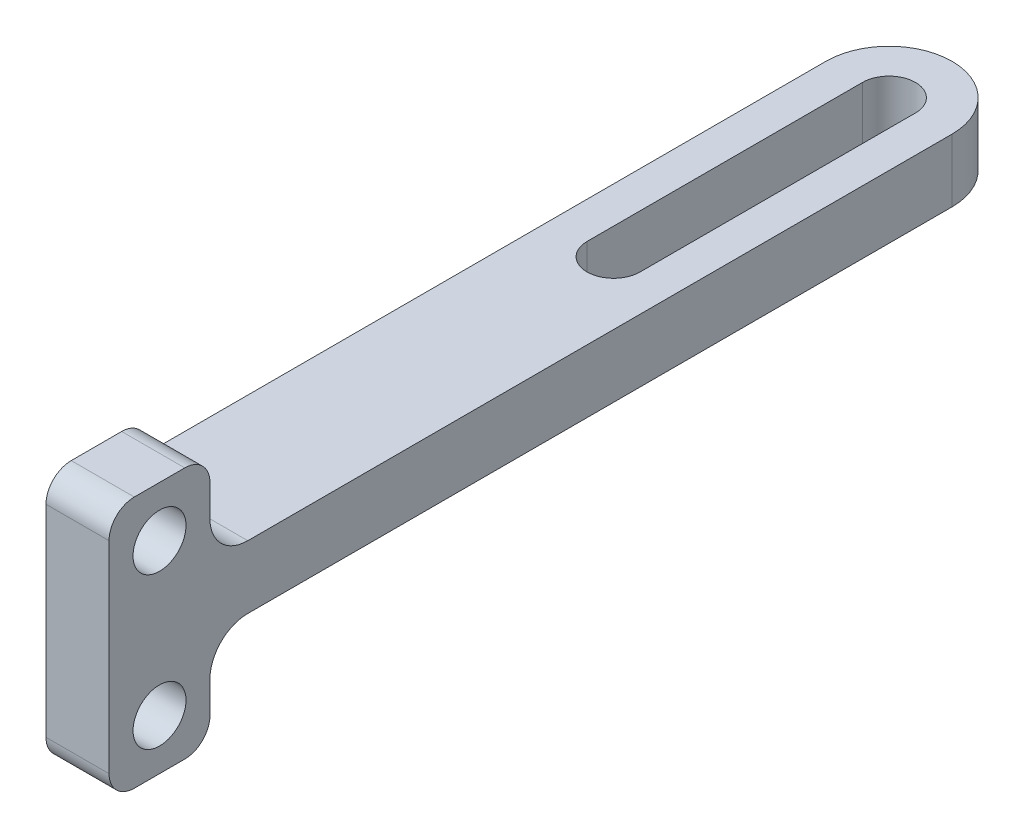
ISO-10303-21;
HEADER;
FILE_DESCRIPTION(('STEP AP214'),'2;1');
FILE_NAME('part.step','',(''),(''),'','','');
FILE_SCHEMA(('AUTOMOTIVE_DESIGN { 1 0 10303 214 1 1 1 1 }'));
ENDSEC;
DATA;
#1=APPLICATION_CONTEXT('core data for automotive mechanical design processes');
#2=APPLICATION_PROTOCOL_DEFINITION('international standard','automotive_design',2000,#1);
#3=PRODUCT_CONTEXT('',#1,'mechanical');
#4=PRODUCT('Part','Part','',(#3));
#5=PRODUCT_RELATED_PRODUCT_CATEGORY('part','',(#4));
#6=PRODUCT_DEFINITION_FORMATION('','',#4);
#7=PRODUCT_DEFINITION_CONTEXT('part definition',#1,'design');
#8=PRODUCT_DEFINITION('design','',#6,#7);
#9=PRODUCT_DEFINITION_SHAPE('','',#8);
#10=(LENGTH_UNIT() NAMED_UNIT(*) SI_UNIT(.MILLI.,.METRE.));
#11=(NAMED_UNIT(*) PLANE_ANGLE_UNIT() SI_UNIT($,.RADIAN.));
#12=(NAMED_UNIT(*) SI_UNIT($,.STERADIAN.) SOLID_ANGLE_UNIT());
#13=UNCERTAINTY_MEASURE_WITH_UNIT(LENGTH_MEASURE(1.E-05),#10,'distance_accuracy_value','');
#14=(GEOMETRIC_REPRESENTATION_CONTEXT(3) GLOBAL_UNCERTAINTY_ASSIGNED_CONTEXT((#13)) GLOBAL_UNIT_ASSIGNED_CONTEXT((#10,
#11,#12)) REPRESENTATION_CONTEXT('',''));
#15=CARTESIAN_POINT('',(0.,0.,0.));
#16=DIRECTION('',(0.,0.,1.));
#17=DIRECTION('',(1.,0.,0.));
#18=AXIS2_PLACEMENT_3D('',#15,#16,#17);
#19=CARTESIAN_POINT('',(-5.,5.,0.));
#20=DIRECTION('',(1.,0.,0.));
#21=DIRECTION('',(0.,0.,-1.));
#22=AXIS2_PLACEMENT_3D('',#19,#20,#21);
#23=PLANE('',#22);
#24=DIRECTION('',(0.,0.,1.));
#25=VECTOR('',#24,1.);
#26=CARTESIAN_POINT('',(-5.,0.,0.));
#27=LINE('',#26,#25);
#28=CARTESIAN_POINT('',(-5.,0.,-13.8358035652075));
#29=VERTEX_POINT('',#28);
#30=CARTESIAN_POINT('',(-5.,0.,39.));
#31=VERTEX_POINT('',#30);
#32=EDGE_CURVE('E296',#29,#31,#27,.T.);
#33=ORIENTED_EDGE('',*,*,#32,.T.);
#34=DIRECTION('',(0.,-1.,0.));
#35=VECTOR('',#34,1.);
#36=CARTESIAN_POINT('',(-5.,5.,39.));
#37=LINE('',#36,#35);
#38=CARTESIAN_POINT('',(-5.,5.,39.));
#39=VERTEX_POINT('',#38);
#40=EDGE_CURVE('E217',#31,#39,#37,.F.);
#41=ORIENTED_EDGE('',*,*,#40,.T.);
#42=DIRECTION('',(0.,0.,1.));
#43=VECTOR('',#42,1.);
#44=CARTESIAN_POINT('',(-5.,5.,0.));
#45=LINE('',#44,#43);
#46=CARTESIAN_POINT('',(-5.,5.,-13.8358035652075));
#47=VERTEX_POINT('',#46);
#48=EDGE_CURVE('E289',#47,#39,#45,.T.);
#49=ORIENTED_EDGE('',*,*,#48,.F.);
#50=DIRECTION('',(0.,-1.,0.));
#51=VECTOR('',#50,1.);
#52=CARTESIAN_POINT('',(-5.,5.,-13.8358035652075));
#53=LINE('',#52,#51);
#54=EDGE_CURVE('E301',#47,#29,#53,.T.);
#55=ORIENTED_EDGE('',*,*,#54,.T.);
#56=EDGE_LOOP('',(#33,#41,#49,#55));
#57=FACE_BOUND('',#56,.T.);
#58=ADVANCED_FACE('F33',(#57),#23,.F.);
#59=CARTESIAN_POINT('',(0.,5.,-13.8358035652075));
#60=DIRECTION('',(0.,1.,0.));
#61=DIRECTION('',(0.,0.,1.));
#62=AXIS2_PLACEMENT_3D('',#59,#60,#61);
#63=PLANE('',#62);
#64=DIRECTION('',(-1.,0.,0.));
#65=VECTOR('',#64,1.);
#66=CARTESIAN_POINT('',(-4.99999999999999,5.,42.));
#67=LINE('',#66,#65);
#68=CARTESIAN_POINT('',(0.,5.,42.));
#69=VERTEX_POINT('',#68);
#70=CARTESIAN_POINT('',(-2.,5.,42.));
#71=VERTEX_POINT('',#70);
#72=EDGE_CURVE('E187',#69,#71,#67,.T.);
#73=ORIENTED_EDGE('',*,*,#72,.F.);
#74=DIRECTION('',(1.,0.,0.));
#75=VECTOR('',#74,1.);
#76=CARTESIAN_POINT('',(5.,5.,42.));
#77=LINE('',#76,#75);
#78=CARTESIAN_POINT('',(5.,5.,42.));
#79=VERTEX_POINT('',#78);
#80=EDGE_CURVE('E195',#69,#79,#77,.T.);
#81=ORIENTED_EDGE('',*,*,#80,.T.);
#82=DIRECTION('',(0.,0.,-1.));
#83=VECTOR('',#82,1.);
#84=CARTESIAN_POINT('',(5.,5.,45.));
#85=LINE('',#84,#83);
#86=CARTESIAN_POINT('',(5.,5.,-13.8358035652075));
#87=VERTEX_POINT('',#86);
#88=EDGE_CURVE('E225',#79,#87,#85,.T.);
#89=ORIENTED_EDGE('',*,*,#88,.T.);
#90=CARTESIAN_POINT('',(0.,5.,-13.8358035652075));
#91=DIRECTION('',(0.,1.,0.));
#92=DIRECTION('',(0.,0.,1.));
#93=AXIS2_PLACEMENT_3D('',#90,#91,#92);
#94=CIRCLE('',#93,5.);
#95=EDGE_CURVE('E286',#87,#47,#94,.T.);
#96=ORIENTED_EDGE('',*,*,#95,.T.);
#97=ORIENTED_EDGE('',*,*,#48,.T.);
#98=CARTESIAN_POINT('',(-2.,5.,39.));
#99=DIRECTION('',(0.,1.,0.));
#100=DIRECTION('',(0.,0.,1.));
#101=AXIS2_PLACEMENT_3D('',#98,#99,#100);
#102=CIRCLE('',#101,3.);
#103=EDGE_CURVE('E199',#39,#71,#102,.T.);
#104=ORIENTED_EDGE('',*,*,#103,.T.);
#105=EDGE_LOOP('',(#73,#81,#89,#96,#97,#104));
#106=FACE_BOUND('',#105,.T.);
#107=DIRECTION('',(0.,0.,-1.));
#108=VECTOR('',#107,1.);
#109=CARTESIAN_POINT('',(2.1,5.,-13.8358035652075));
#110=LINE('',#109,#108);
#111=CARTESIAN_POINT('',(2.1,5.,8.));
#112=VERTEX_POINT('',#111);
#113=CARTESIAN_POINT('',(2.1,5.,-13.8358035652075));
#114=VERTEX_POINT('',#113);
#115=EDGE_CURVE('E257',#112,#114,#110,.T.);
#116=ORIENTED_EDGE('',*,*,#115,.F.);
#117=CARTESIAN_POINT('',(0.,5.,8.));
#118=DIRECTION('',(0.,1.,0.));
#119=DIRECTION('',(0.,0.,1.));
#120=AXIS2_PLACEMENT_3D('',#117,#118,#119);
#121=CIRCLE('',#120,2.1);
#122=CARTESIAN_POINT('',(-2.1,5.,8.));
#123=VERTEX_POINT('',#122);
#124=EDGE_CURVE('E255',#123,#112,#121,.T.);
#125=ORIENTED_EDGE('',*,*,#124,.F.);
#126=DIRECTION('',(0.,0.,1.));
#127=VECTOR('',#126,1.);
#128=CARTESIAN_POINT('',(-2.1,5.,8.));
#129=LINE('',#128,#127);
#130=CARTESIAN_POINT('',(-2.1,5.,-13.8358035652075));
#131=VERTEX_POINT('',#130);
#132=EDGE_CURVE('E263',#131,#123,#129,.T.);
#133=ORIENTED_EDGE('',*,*,#132,.F.);
#134=CARTESIAN_POINT('',(0.,5.,-13.8358035652075));
#135=DIRECTION('',(0.,1.,0.));
#136=DIRECTION('',(0.,0.,1.));
#137=AXIS2_PLACEMENT_3D('',#134,#135,#136);
#138=CIRCLE('',#137,2.1);
#139=EDGE_CURVE('E260',#114,#131,#138,.T.);
#140=ORIENTED_EDGE('',*,*,#139,.F.);
#141=EDGE_LOOP('',(#116,#125,#133,#140));
#142=FACE_BOUND('',#141,.T.);
#143=ADVANCED_FACE('F193',(#106,#142),#63,.T.);
#144=CARTESIAN_POINT('',(0.,0.,-13.8358035652075));
#145=DIRECTION('',(0.,1.,0.));
#146=DIRECTION('',(0.,0.,1.));
#147=AXIS2_PLACEMENT_3D('',#144,#145,#146);
#148=PLANE('',#147);
#149=DIRECTION('',(0.,0.,-1.));
#150=VECTOR('',#149,1.);
#151=CARTESIAN_POINT('',(5.,0.,0.));
#152=LINE('',#151,#150);
#153=CARTESIAN_POINT('',(5.,0.,42.));
#154=VERTEX_POINT('',#153);
#155=CARTESIAN_POINT('',(5.,0.,-13.8358035652075));
#156=VERTEX_POINT('',#155);
#157=EDGE_CURVE('E290',#154,#156,#152,.T.);
#158=ORIENTED_EDGE('',*,*,#157,.F.);
#159=DIRECTION('',(1.,0.,0.));
#160=VECTOR('',#159,1.);
#161=CARTESIAN_POINT('',(0.,0.,42.));
#162=LINE('',#161,#160);
#163=CARTESIAN_POINT('',(0.,0.,42.));
#164=VERTEX_POINT('',#163);
#165=EDGE_CURVE('E213',#154,#164,#162,.F.);
#166=ORIENTED_EDGE('',*,*,#165,.T.);
#167=DIRECTION('',(1.,0.,0.));
#168=VECTOR('',#167,1.);
#169=CARTESIAN_POINT('',(-4.99999999999999,0.,42.));
#170=LINE('',#169,#168);
#171=CARTESIAN_POINT('',(-2.,0.,42.));
#172=VERTEX_POINT('',#171);
#173=EDGE_CURVE('E189',#172,#164,#170,.T.);
#174=ORIENTED_EDGE('',*,*,#173,.F.);
#175=CARTESIAN_POINT('',(-2.,0.,39.));
#176=DIRECTION('',(0.,1.,0.));
#177=DIRECTION('',(0.,0.,1.));
#178=AXIS2_PLACEMENT_3D('',#175,#176,#177);
#179=CIRCLE('',#178,3.);
#180=EDGE_CURVE('E55',#172,#31,#179,.F.);
#181=ORIENTED_EDGE('',*,*,#180,.T.);
#182=ORIENTED_EDGE('',*,*,#32,.F.);
#183=CARTESIAN_POINT('',(0.,0.,-13.8358035652075));
#184=DIRECTION('',(0.,1.,0.));
#185=DIRECTION('',(0.,0.,1.));
#186=AXIS2_PLACEMENT_3D('',#183,#184,#185);
#187=CIRCLE('',#186,5.);
#188=EDGE_CURVE('E285',#156,#29,#187,.T.);
#189=ORIENTED_EDGE('',*,*,#188,.F.);
#190=EDGE_LOOP('',(#158,#166,#174,#181,#182,#189));
#191=FACE_BOUND('',#190,.T.);
#192=CARTESIAN_POINT('',(0.,0.,8.));
#193=DIRECTION('',(0.,1.,0.));
#194=DIRECTION('',(0.,0.,1.));
#195=AXIS2_PLACEMENT_3D('',#192,#193,#194);
#196=CIRCLE('',#195,2.1);
#197=CARTESIAN_POINT('',(-2.1,0.,8.));
#198=VERTEX_POINT('',#197);
#199=CARTESIAN_POINT('',(2.1,0.,8.));
#200=VERTEX_POINT('',#199);
#201=EDGE_CURVE('E254',#198,#200,#196,.T.);
#202=ORIENTED_EDGE('',*,*,#201,.T.);
#203=DIRECTION('',(0.,0.,-1.));
#204=VECTOR('',#203,1.);
#205=CARTESIAN_POINT('',(2.1,0.,-13.8358035652075));
#206=LINE('',#205,#204);
#207=CARTESIAN_POINT('',(2.1,0.,-13.8358035652075));
#208=VERTEX_POINT('',#207);
#209=EDGE_CURVE('E268',#200,#208,#206,.T.);
#210=ORIENTED_EDGE('',*,*,#209,.T.);
#211=CARTESIAN_POINT('',(0.,0.,-13.8358035652075));
#212=DIRECTION('',(0.,1.,0.));
#213=DIRECTION('',(0.,0.,1.));
#214=AXIS2_PLACEMENT_3D('',#211,#212,#213);
#215=CIRCLE('',#214,2.1);
#216=CARTESIAN_POINT('',(-2.1,0.,-13.8358035652075));
#217=VERTEX_POINT('',#216);
#218=EDGE_CURVE('E271',#208,#217,#215,.T.);
#219=ORIENTED_EDGE('',*,*,#218,.T.);
#220=DIRECTION('',(0.,0.,1.));
#221=VECTOR('',#220,1.);
#222=CARTESIAN_POINT('',(-2.1,0.,8.));
#223=LINE('',#222,#221);
#224=EDGE_CURVE('E258',#217,#198,#223,.T.);
#225=ORIENTED_EDGE('',*,*,#224,.T.);
#226=EDGE_LOOP('',(#202,#210,#219,#225));
#227=FACE_BOUND('',#226,.T.);
#228=ADVANCED_FACE('F401',(#191,#227),#148,.F.);
#229=CARTESIAN_POINT('',(0.,5.,-13.8358035652075));
#230=DIRECTION('',(0.,-1.,0.));
#231=DIRECTION('',(0.,0.,-1.));
#232=AXIS2_PLACEMENT_3D('',#229,#230,#231);
#233=CYLINDRICAL_SURFACE('',#232,5.);
#234=ORIENTED_EDGE('',*,*,#188,.T.);
#235=ORIENTED_EDGE('',*,*,#54,.F.);
#236=ORIENTED_EDGE('',*,*,#95,.F.);
#237=DIRECTION('',(0.,-1.,0.));
#238=VECTOR('',#237,1.);
#239=CARTESIAN_POINT('',(5.,5.,-13.8358035652075));
#240=LINE('',#239,#238);
#241=EDGE_CURVE('E293',#87,#156,#240,.T.);
#242=ORIENTED_EDGE('',*,*,#241,.T.);
#243=EDGE_LOOP('',(#234,#235,#236,#242));
#244=FACE_BOUND('',#243,.T.);
#245=ADVANCED_FACE('F373',(#244),#233,.T.);
#246=CARTESIAN_POINT('',(5.,5.,0.));
#247=DIRECTION('',(-1.,0.,0.));
#248=DIRECTION('',(0.,0.,1.));
#249=AXIS2_PLACEMENT_3D('',#246,#247,#248);
#250=PLANE('',#249);
#251=CARTESIAN_POINT('',(5.,8.5,49.));
#252=DIRECTION('',(1.,0.,0.));
#253=DIRECTION('',(0.,0.,-1.));
#254=AXIS2_PLACEMENT_3D('',#251,#252,#253);
#255=CIRCLE('',#254,2.1);
#256=CARTESIAN_POINT('',(5.,8.5,46.9));
#257=VERTEX_POINT('',#256);
#258=EDGE_CURVE('E306',#257,#257,#255,.T.);
#259=ORIENTED_EDGE('',*,*,#258,.F.);
#260=EDGE_LOOP('',(#259));
#261=FACE_BOUND('',#260,.T.);
#262=CARTESIAN_POINT('',(5.,-3.5,49.));
#263=DIRECTION('',(1.,0.,0.));
#264=DIRECTION('',(0.,0.,-1.));
#265=AXIS2_PLACEMENT_3D('',#262,#263,#264);
#266=CIRCLE('',#265,2.1);
#267=CARTESIAN_POINT('',(5.,-3.5,46.9));
#268=VERTEX_POINT('',#267);
#269=EDGE_CURVE('E360',#268,#268,#266,.T.);
#270=ORIENTED_EDGE('',*,*,#269,.F.);
#271=EDGE_LOOP('',(#270));
#272=FACE_BOUND('',#271,.T.);
#273=DIRECTION('',(0.,0.,-1.));
#274=VECTOR('',#273,1.);
#275=CARTESIAN_POINT('',(5.,-7.5,53.));
#276=LINE('',#275,#274);
#277=CARTESIAN_POINT('',(5.,-7.5,51.));
#278=VERTEX_POINT('',#277);
#279=CARTESIAN_POINT('',(5.,-7.5,47.));
#280=VERTEX_POINT('',#279);
#281=EDGE_CURVE('E243',#278,#280,#276,.T.);
#282=ORIENTED_EDGE('',*,*,#281,.T.);
#283=CARTESIAN_POINT('',(5.,-5.5,47.));
#284=DIRECTION('',(-1.,0.,0.));
#285=DIRECTION('',(0.,0.,1.));
#286=AXIS2_PLACEMENT_3D('',#283,#284,#285);
#287=CIRCLE('',#286,2.);
#288=CARTESIAN_POINT('',(5.,-5.5,45.));
#289=VERTEX_POINT('',#288);
#290=EDGE_CURVE('E318',#280,#289,#287,.F.);
#291=ORIENTED_EDGE('',*,*,#290,.T.);
#292=DIRECTION('',(0.,1.,0.));
#293=VECTOR('',#292,1.);
#294=CARTESIAN_POINT('',(5.,-7.5,45.));
#295=LINE('',#294,#293);
#296=CARTESIAN_POINT('',(5.,-3.,45.));
#297=VERTEX_POINT('',#296);
#298=EDGE_CURVE('E230',#289,#297,#295,.T.);
#299=ORIENTED_EDGE('',*,*,#298,.T.);
#300=CARTESIAN_POINT('',(5.,-3.,42.));
#301=DIRECTION('',(-1.,0.,0.));
#302=DIRECTION('',(0.,0.,1.));
#303=AXIS2_PLACEMENT_3D('',#300,#301,#302);
#304=CIRCLE('',#303,3.);
#305=EDGE_CURVE('E41',#297,#154,#304,.T.);
#306=ORIENTED_EDGE('',*,*,#305,.T.);
#307=ORIENTED_EDGE('',*,*,#157,.T.);
#308=ORIENTED_EDGE('',*,*,#241,.F.);
#309=ORIENTED_EDGE('',*,*,#88,.F.);
#310=CARTESIAN_POINT('',(5.,8.,42.));
#311=DIRECTION('',(-1.,0.,0.));
#312=DIRECTION('',(0.,0.,1.));
#313=AXIS2_PLACEMENT_3D('',#310,#311,#312);
#314=CIRCLE('',#313,3.);
#315=CARTESIAN_POINT('',(5.,8.,45.));
#316=VERTEX_POINT('',#315);
#317=EDGE_CURVE('E179',#79,#316,#314,.T.);
#318=ORIENTED_EDGE('',*,*,#317,.T.);
#319=CARTESIAN_POINT('',(5.,10.5,45.));
#320=VERTEX_POINT('',#319);
#321=EDGE_CURVE('E222',#316,#320,#295,.T.);
#322=ORIENTED_EDGE('',*,*,#321,.T.);
#323=CARTESIAN_POINT('',(5.,10.5,47.));
#324=DIRECTION('',(-1.,0.,0.));
#325=DIRECTION('',(0.,0.,1.));
#326=AXIS2_PLACEMENT_3D('',#323,#324,#325);
#327=CIRCLE('',#326,2.);
#328=CARTESIAN_POINT('',(5.,12.5,47.));
#329=VERTEX_POINT('',#328);
#330=EDGE_CURVE('E314',#320,#329,#327,.F.);
#331=ORIENTED_EDGE('',*,*,#330,.T.);
#332=DIRECTION('',(0.,0.,-1.));
#333=VECTOR('',#332,1.);
#334=CARTESIAN_POINT('',(5.,12.5,53.));
#335=LINE('',#334,#333);
#336=CARTESIAN_POINT('',(5.,12.5,51.));
#337=VERTEX_POINT('',#336);
#338=EDGE_CURVE('E251',#337,#329,#335,.T.);
#339=ORIENTED_EDGE('',*,*,#338,.F.);
#340=CARTESIAN_POINT('',(5.,10.5,51.));
#341=DIRECTION('',(-1.,0.,0.));
#342=DIRECTION('',(0.,0.,1.));
#343=AXIS2_PLACEMENT_3D('',#340,#341,#342);
#344=CIRCLE('',#343,2.);
#345=CARTESIAN_POINT('',(5.,10.5,53.));
#346=VERTEX_POINT('',#345);
#347=EDGE_CURVE('E312',#337,#346,#344,.F.);
#348=ORIENTED_EDGE('',*,*,#347,.T.);
#349=DIRECTION('',(0.,1.,0.));
#350=VECTOR('',#349,1.);
#351=CARTESIAN_POINT('',(5.,-7.5,53.));
#352=LINE('',#351,#350);
#353=CARTESIAN_POINT('',(5.,-5.5,53.));
#354=VERTEX_POINT('',#353);
#355=EDGE_CURVE('E242',#354,#346,#352,.T.);
#356=ORIENTED_EDGE('',*,*,#355,.F.);
#357=CARTESIAN_POINT('',(5.,-5.5,51.));
#358=DIRECTION('',(-1.,0.,0.));
#359=DIRECTION('',(0.,0.,1.));
#360=AXIS2_PLACEMENT_3D('',#357,#358,#359);
#361=CIRCLE('',#360,2.);
#362=EDGE_CURVE('E316',#354,#278,#361,.F.);
#363=ORIENTED_EDGE('',*,*,#362,.T.);
#364=EDGE_LOOP('',(#282,#291,#299,#306,#307,#308,#309,#318,#322,#331,#339,#348,#356,#363));
#365=FACE_BOUND('',#364,.T.);
#366=ADVANCED_FACE('F221',(#261,#272,#365),#250,.F.);
#367=CARTESIAN_POINT('',(0.,5.,8.));
#368=DIRECTION('',(0.,-1.,0.));
#369=DIRECTION('',(0.,0.,-1.));
#370=AXIS2_PLACEMENT_3D('',#367,#368,#369);
#371=CYLINDRICAL_SURFACE('',#370,2.1);
#372=ORIENTED_EDGE('',*,*,#201,.F.);
#373=DIRECTION('',(0.,-1.,0.));
#374=VECTOR('',#373,1.);
#375=CARTESIAN_POINT('',(-2.1,5.,8.));
#376=LINE('',#375,#374);
#377=EDGE_CURVE('E265',#123,#198,#376,.T.);
#378=ORIENTED_EDGE('',*,*,#377,.F.);
#379=ORIENTED_EDGE('',*,*,#124,.T.);
#380=DIRECTION('',(0.,-1.,0.));
#381=VECTOR('',#380,1.);
#382=CARTESIAN_POINT('',(2.1,5.,8.));
#383=LINE('',#382,#381);
#384=EDGE_CURVE('E282',#112,#200,#383,.T.);
#385=ORIENTED_EDGE('',*,*,#384,.T.);
#386=EDGE_LOOP('',(#372,#378,#379,#385));
#387=FACE_BOUND('',#386,.T.);
#388=ADVANCED_FACE('F372',(#387),#371,.F.);
#389=CARTESIAN_POINT('',(2.1,5.,-13.8358035652075));
#390=DIRECTION('',(-1.,0.,0.));
#391=DIRECTION('',(0.,0.,1.));
#392=AXIS2_PLACEMENT_3D('',#389,#390,#391);
#393=PLANE('',#392);
#394=ORIENTED_EDGE('',*,*,#209,.F.);
#395=ORIENTED_EDGE('',*,*,#384,.F.);
#396=ORIENTED_EDGE('',*,*,#115,.T.);
#397=DIRECTION('',(0.,-1.,0.));
#398=VECTOR('',#397,1.);
#399=CARTESIAN_POINT('',(2.1,5.,-13.8358035652075));
#400=LINE('',#399,#398);
#401=EDGE_CURVE('E280',#114,#208,#400,.T.);
#402=ORIENTED_EDGE('',*,*,#401,.T.);
#403=EDGE_LOOP('',(#394,#395,#396,#402));
#404=FACE_BOUND('',#403,.T.);
#405=ADVANCED_FACE('F458',(#404),#393,.T.);
#406=CARTESIAN_POINT('',(0.,5.,-13.8358035652075));
#407=DIRECTION('',(0.,-1.,0.));
#408=DIRECTION('',(0.,0.,-1.));
#409=AXIS2_PLACEMENT_3D('',#406,#407,#408);
#410=CYLINDRICAL_SURFACE('',#409,2.1);
#411=ORIENTED_EDGE('',*,*,#218,.F.);
#412=ORIENTED_EDGE('',*,*,#401,.F.);
#413=ORIENTED_EDGE('',*,*,#139,.T.);
#414=DIRECTION('',(0.,-1.,0.));
#415=VECTOR('',#414,1.);
#416=CARTESIAN_POINT('',(-2.1,5.,-13.8358035652075));
#417=LINE('',#416,#415);
#418=EDGE_CURVE('E278',#131,#217,#417,.T.);
#419=ORIENTED_EDGE('',*,*,#418,.T.);
#420=EDGE_LOOP('',(#411,#412,#413,#419));
#421=FACE_BOUND('',#420,.T.);
#422=ADVANCED_FACE('F452',(#421),#410,.F.);
#423=CARTESIAN_POINT('',(-2.1,5.,8.));
#424=DIRECTION('',(1.,0.,0.));
#425=DIRECTION('',(0.,0.,-1.));
#426=AXIS2_PLACEMENT_3D('',#423,#424,#425);
#427=PLANE('',#426);
#428=ORIENTED_EDGE('',*,*,#224,.F.);
#429=ORIENTED_EDGE('',*,*,#418,.F.);
#430=ORIENTED_EDGE('',*,*,#132,.T.);
#431=ORIENTED_EDGE('',*,*,#377,.T.);
#432=EDGE_LOOP('',(#428,#429,#430,#431));
#433=FACE_BOUND('',#432,.T.);
#434=ADVANCED_FACE('F448',(#433),#427,.T.);
#435=CARTESIAN_POINT('',(0.,0.,45.));
#436=DIRECTION('',(0.,0.,-1.));
#437=DIRECTION('',(-1.,0.,0.));
#438=AXIS2_PLACEMENT_3D('',#435,#436,#437);
#439=PLANE('',#438);
#440=ORIENTED_EDGE('',*,*,#321,.F.);
#441=DIRECTION('',(1.,0.,0.));
#442=VECTOR('',#441,1.);
#443=CARTESIAN_POINT('',(0.,8.,45.));
#444=LINE('',#443,#442);
#445=CARTESIAN_POINT('',(0.,8.,45.));
#446=VERTEX_POINT('',#445);
#447=EDGE_CURVE('E202',#316,#446,#444,.F.);
#448=ORIENTED_EDGE('',*,*,#447,.T.);
#449=DIRECTION('',(0.,-1.,0.));
#450=VECTOR('',#449,1.);
#451=CARTESIAN_POINT('',(0.,12.5,45.));
#452=LINE('',#451,#450);
#453=CARTESIAN_POINT('',(0.,10.5,45.));
#454=VERTEX_POINT('',#453);
#455=EDGE_CURVE('E175',#454,#446,#452,.T.);
#456=ORIENTED_EDGE('',*,*,#455,.F.);
#457=DIRECTION('',(-1.,0.,0.));
#458=VECTOR('',#457,1.);
#459=CARTESIAN_POINT('',(5.,10.5,45.));
#460=LINE('',#459,#458);
#461=EDGE_CURVE('E206',#454,#320,#460,.F.);
#462=ORIENTED_EDGE('',*,*,#461,.T.);
#463=EDGE_LOOP('',(#440,#448,#456,#462));
#464=FACE_BOUND('',#463,.T.);
#465=ADVANCED_FACE('F227',(#464),#439,.T.);
#466=CARTESIAN_POINT('',(0.,12.5,53.));
#467=DIRECTION('',(0.,-1.,0.));
#468=DIRECTION('',(0.,0.,-1.));
#469=AXIS2_PLACEMENT_3D('',#466,#467,#468);
#470=PLANE('',#469);
#471=ORIENTED_EDGE('',*,*,#338,.T.);
#472=DIRECTION('',(-1.,0.,0.));
#473=VECTOR('',#472,1.);
#474=CARTESIAN_POINT('',(0.,12.5,47.));
#475=LINE('',#474,#473);
#476=CARTESIAN_POINT('',(0.,12.5,47.));
#477=VERTEX_POINT('',#476);
#478=EDGE_CURVE('E339',#329,#477,#475,.T.);
#479=ORIENTED_EDGE('',*,*,#478,.T.);
#480=DIRECTION('',(0.,0.,-1.));
#481=VECTOR('',#480,1.);
#482=CARTESIAN_POINT('',(0.,12.5,53.));
#483=LINE('',#482,#481);
#484=CARTESIAN_POINT('',(0.,12.5,51.));
#485=VERTEX_POINT('',#484);
#486=EDGE_CURVE('E248',#485,#477,#483,.T.);
#487=ORIENTED_EDGE('',*,*,#486,.F.);
#488=DIRECTION('',(-1.,0.,0.));
#489=VECTOR('',#488,1.);
#490=CARTESIAN_POINT('',(0.,12.5,51.));
#491=LINE('',#490,#489);
#492=EDGE_CURVE('E337',#485,#337,#491,.F.);
#493=ORIENTED_EDGE('',*,*,#492,.T.);
#494=EDGE_LOOP('',(#471,#479,#487,#493));
#495=FACE_BOUND('',#494,.T.);
#496=ADVANCED_FACE('F344',(#495),#470,.F.);
#497=CARTESIAN_POINT('',(0.,12.5,53.));
#498=DIRECTION('',(1.,0.,0.));
#499=DIRECTION('',(0.,0.,-1.));
#500=AXIS2_PLACEMENT_3D('',#497,#498,#499);
#501=PLANE('',#500);
#502=CARTESIAN_POINT('',(0.,8.5,49.));
#503=DIRECTION('',(1.,0.,0.));
#504=DIRECTION('',(0.,0.,-1.));
#505=AXIS2_PLACEMENT_3D('',#502,#503,#504);
#506=CIRCLE('',#505,2.1);
#507=CARTESIAN_POINT('',(0.,8.5,46.9));
#508=VERTEX_POINT('',#507);
#509=EDGE_CURVE('E231',#508,#508,#506,.T.);
#510=ORIENTED_EDGE('',*,*,#509,.T.);
#511=EDGE_LOOP('',(#510));
#512=FACE_BOUND('',#511,.T.);
#513=CARTESIAN_POINT('',(0.,-3.5,49.));
#514=DIRECTION('',(1.,0.,0.));
#515=DIRECTION('',(0.,0.,-1.));
#516=AXIS2_PLACEMENT_3D('',#513,#514,#515);
#517=CIRCLE('',#516,2.1);
#518=CARTESIAN_POINT('',(0.,-3.5,46.9));
#519=VERTEX_POINT('',#518);
#520=EDGE_CURVE('E235',#519,#519,#517,.T.);
#521=ORIENTED_EDGE('',*,*,#520,.T.);
#522=EDGE_LOOP('',(#521));
#523=FACE_BOUND('',#522,.T.);
#524=DIRECTION('',(0.,1.,0.));
#525=VECTOR('',#524,1.);
#526=CARTESIAN_POINT('',(0.,5.,42.));
#527=LINE('',#526,#525);
#528=EDGE_CURVE('E172',#164,#69,#527,.T.);
#529=ORIENTED_EDGE('',*,*,#528,.F.);
#530=CARTESIAN_POINT('',(0.,-3.,42.));
#531=DIRECTION('',(1.,0.,0.));
#532=DIRECTION('',(0.,0.,-1.));
#533=AXIS2_PLACEMENT_3D('',#530,#531,#532);
#534=CIRCLE('',#533,3.);
#535=CARTESIAN_POINT('',(0.,-3.,45.));
#536=VERTEX_POINT('',#535);
#537=EDGE_CURVE('E11',#164,#536,#534,.T.);
#538=ORIENTED_EDGE('',*,*,#537,.T.);
#539=CARTESIAN_POINT('',(0.,-5.5,45.));
#540=VERTEX_POINT('',#539);
#541=EDGE_CURVE('E233',#536,#540,#452,.T.);
#542=ORIENTED_EDGE('',*,*,#541,.T.);
#543=CARTESIAN_POINT('',(0.,-5.5,47.));
#544=DIRECTION('',(1.,0.,0.));
#545=DIRECTION('',(0.,0.,-1.));
#546=AXIS2_PLACEMENT_3D('',#543,#544,#545);
#547=CIRCLE('',#546,2.);
#548=CARTESIAN_POINT('',(0.,-7.5,47.));
#549=VERTEX_POINT('',#548);
#550=EDGE_CURVE('E329',#540,#549,#547,.F.);
#551=ORIENTED_EDGE('',*,*,#550,.T.);
#552=DIRECTION('',(0.,0.,-1.));
#553=VECTOR('',#552,1.);
#554=CARTESIAN_POINT('',(0.,-7.5,53.));
#555=LINE('',#554,#553);
#556=CARTESIAN_POINT('',(0.,-7.5,51.));
#557=VERTEX_POINT('',#556);
#558=EDGE_CURVE('E245',#557,#549,#555,.T.);
#559=ORIENTED_EDGE('',*,*,#558,.F.);
#560=CARTESIAN_POINT('',(0.,-5.5,51.));
#561=DIRECTION('',(1.,0.,0.));
#562=DIRECTION('',(0.,0.,-1.));
#563=AXIS2_PLACEMENT_3D('',#560,#561,#562);
#564=CIRCLE('',#563,2.);
#565=CARTESIAN_POINT('',(0.,-5.5,53.));
#566=VERTEX_POINT('',#565);
#567=EDGE_CURVE('E327',#557,#566,#564,.F.);
#568=ORIENTED_EDGE('',*,*,#567,.T.);
#569=DIRECTION('',(0.,-1.,0.));
#570=VECTOR('',#569,1.);
#571=CARTESIAN_POINT('',(0.,12.5,53.));
#572=LINE('',#571,#570);
#573=CARTESIAN_POINT('',(0.,10.5,53.));
#574=VERTEX_POINT('',#573);
#575=EDGE_CURVE('E239',#574,#566,#572,.T.);
#576=ORIENTED_EDGE('',*,*,#575,.F.);
#577=CARTESIAN_POINT('',(0.,10.5,51.));
#578=DIRECTION('',(1.,0.,0.));
#579=DIRECTION('',(0.,0.,-1.));
#580=AXIS2_PLACEMENT_3D('',#577,#578,#579);
#581=CIRCLE('',#580,2.);
#582=EDGE_CURVE('E323',#574,#485,#581,.F.);
#583=ORIENTED_EDGE('',*,*,#582,.T.);
#584=ORIENTED_EDGE('',*,*,#486,.T.);
#585=CARTESIAN_POINT('',(0.,10.5,47.));
#586=DIRECTION('',(1.,0.,0.));
#587=DIRECTION('',(0.,0.,-1.));
#588=AXIS2_PLACEMENT_3D('',#585,#586,#587);
#589=CIRCLE('',#588,2.);
#590=EDGE_CURVE('E325',#477,#454,#589,.F.);
#591=ORIENTED_EDGE('',*,*,#590,.T.);
#592=ORIENTED_EDGE('',*,*,#455,.T.);
#593=CARTESIAN_POINT('',(0.,8.,42.));
#594=DIRECTION('',(1.,0.,0.));
#595=DIRECTION('',(0.,0.,-1.));
#596=AXIS2_PLACEMENT_3D('',#593,#594,#595);
#597=CIRCLE('',#596,3.);
#598=EDGE_CURVE('E169',#446,#69,#597,.T.);
#599=ORIENTED_EDGE('',*,*,#598,.T.);
#600=EDGE_LOOP('',(#529,#538,#542,#551,#559,#568,#576,#583,#584,#591,#592,#599));
#601=FACE_BOUND('',#600,.T.);
#602=ADVANCED_FACE('F171',(#512,#523,#601),#501,.F.);
#603=CARTESIAN_POINT('',(0.,-7.5,53.));
#604=DIRECTION('',(0.,1.,0.));
#605=DIRECTION('',(0.,0.,1.));
#606=AXIS2_PLACEMENT_3D('',#603,#604,#605);
#607=PLANE('',#606);
#608=ORIENTED_EDGE('',*,*,#558,.T.);
#609=DIRECTION('',(1.,0.,0.));
#610=VECTOR('',#609,1.);
#611=CARTESIAN_POINT('',(5.,-7.5,47.));
#612=LINE('',#611,#610);
#613=EDGE_CURVE('E309',#549,#280,#612,.T.);
#614=ORIENTED_EDGE('',*,*,#613,.T.);
#615=ORIENTED_EDGE('',*,*,#281,.F.);
#616=DIRECTION('',(1.,0.,0.));
#617=VECTOR('',#616,1.);
#618=CARTESIAN_POINT('',(0.,-7.5,51.));
#619=LINE('',#618,#617);
#620=EDGE_CURVE('E304',#278,#557,#619,.F.);
#621=ORIENTED_EDGE('',*,*,#620,.T.);
#622=EDGE_LOOP('',(#608,#614,#615,#621));
#623=FACE_BOUND('',#622,.T.);
#624=ADVANCED_FACE('F385',(#623),#607,.F.);
#625=CARTESIAN_POINT('',(0.,0.,53.));
#626=DIRECTION('',(0.,0.,-1.));
#627=DIRECTION('',(-1.,0.,0.));
#628=AXIS2_PLACEMENT_3D('',#625,#626,#627);
#629=PLANE('',#628);
#630=ORIENTED_EDGE('',*,*,#575,.T.);
#631=DIRECTION('',(1.,0.,0.));
#632=VECTOR('',#631,1.);
#633=CARTESIAN_POINT('',(0.,-5.5,53.));
#634=LINE('',#633,#632);
#635=EDGE_CURVE('E334',#566,#354,#634,.T.);
#636=ORIENTED_EDGE('',*,*,#635,.T.);
#637=ORIENTED_EDGE('',*,*,#355,.T.);
#638=DIRECTION('',(-1.,0.,0.));
#639=VECTOR('',#638,1.);
#640=CARTESIAN_POINT('',(0.,10.5,53.));
#641=LINE('',#640,#639);
#642=EDGE_CURVE('E331',#346,#574,#641,.T.);
#643=ORIENTED_EDGE('',*,*,#642,.T.);
#644=EDGE_LOOP('',(#630,#636,#637,#643));
#645=FACE_BOUND('',#644,.T.);
#646=ADVANCED_FACE('F356',(#645),#629,.F.);
#647=ORIENTED_EDGE('',*,*,#541,.F.);
#648=DIRECTION('',(1.,0.,0.));
#649=VECTOR('',#648,1.);
#650=CARTESIAN_POINT('',(0.,-3.,45.));
#651=LINE('',#650,#649);
#652=EDGE_CURVE('E204',#536,#297,#651,.T.);
#653=ORIENTED_EDGE('',*,*,#652,.T.);
#654=ORIENTED_EDGE('',*,*,#298,.F.);
#655=DIRECTION('',(1.,0.,0.));
#656=VECTOR('',#655,1.);
#657=CARTESIAN_POINT('',(0.,-5.5,45.));
#658=LINE('',#657,#656);
#659=EDGE_CURVE('E320',#289,#540,#658,.F.);
#660=ORIENTED_EDGE('',*,*,#659,.T.);
#661=EDGE_LOOP('',(#647,#653,#654,#660));
#662=FACE_BOUND('',#661,.T.);
#663=ADVANCED_FACE('F380',(#662),#439,.T.);
#664=CARTESIAN_POINT('',(-3.,-3.5,49.));
#665=DIRECTION('',(1.,0.,0.));
#666=DIRECTION('',(0.,0.,-1.));
#667=AXIS2_PLACEMENT_3D('',#664,#665,#666);
#668=CYLINDRICAL_SURFACE('',#667,2.1);
#669=ORIENTED_EDGE('',*,*,#269,.T.);
#670=EDGE_LOOP('',(#669));
#671=FACE_BOUND('',#670,.T.);
#672=ORIENTED_EDGE('',*,*,#520,.F.);
#673=EDGE_LOOP('',(#672));
#674=FACE_BOUND('',#673,.T.);
#675=ADVANCED_FACE('F377',(#671,#674),#668,.F.);
#676=CARTESIAN_POINT('',(-3.,8.5,49.));
#677=DIRECTION('',(1.,0.,0.));
#678=DIRECTION('',(0.,0.,-1.));
#679=AXIS2_PLACEMENT_3D('',#676,#677,#678);
#680=CYLINDRICAL_SURFACE('',#679,2.1);
#681=ORIENTED_EDGE('',*,*,#258,.T.);
#682=EDGE_LOOP('',(#681));
#683=FACE_BOUND('',#682,.T.);
#684=ORIENTED_EDGE('',*,*,#509,.F.);
#685=EDGE_LOOP('',(#684));
#686=FACE_BOUND('',#685,.T.);
#687=ADVANCED_FACE('F367',(#683,#686),#680,.F.);
#688=CARTESIAN_POINT('',(0.,-5.5,47.));
#689=DIRECTION('',(-1.,0.,0.));
#690=DIRECTION('',(0.,0.,1.));
#691=AXIS2_PLACEMENT_3D('',#688,#689,#690);
#692=CYLINDRICAL_SURFACE('',#691,2.);
#693=ORIENTED_EDGE('',*,*,#550,.F.);
#694=ORIENTED_EDGE('',*,*,#659,.F.);
#695=ORIENTED_EDGE('',*,*,#290,.F.);
#696=ORIENTED_EDGE('',*,*,#613,.F.);
#697=EDGE_LOOP('',(#693,#694,#695,#696));
#698=FACE_BOUND('',#697,.T.);
#699=ADVANCED_FACE('F408',(#698),#692,.T.);
#700=CARTESIAN_POINT('',(0.,-5.5,51.));
#701=DIRECTION('',(1.,0.,0.));
#702=DIRECTION('',(0.,0.,-1.));
#703=AXIS2_PLACEMENT_3D('',#700,#701,#702);
#704=CYLINDRICAL_SURFACE('',#703,2.);
#705=ORIENTED_EDGE('',*,*,#567,.F.);
#706=ORIENTED_EDGE('',*,*,#620,.F.);
#707=ORIENTED_EDGE('',*,*,#362,.F.);
#708=ORIENTED_EDGE('',*,*,#635,.F.);
#709=EDGE_LOOP('',(#705,#706,#707,#708));
#710=FACE_BOUND('',#709,.T.);
#711=ADVANCED_FACE('F411',(#710),#704,.T.);
#712=CARTESIAN_POINT('',(0.,10.5,47.));
#713=DIRECTION('',(1.,0.,0.));
#714=DIRECTION('',(0.,0.,-1.));
#715=AXIS2_PLACEMENT_3D('',#712,#713,#714);
#716=CYLINDRICAL_SURFACE('',#715,2.);
#717=ORIENTED_EDGE('',*,*,#330,.F.);
#718=ORIENTED_EDGE('',*,*,#461,.F.);
#719=ORIENTED_EDGE('',*,*,#590,.F.);
#720=ORIENTED_EDGE('',*,*,#478,.F.);
#721=EDGE_LOOP('',(#717,#718,#719,#720));
#722=FACE_BOUND('',#721,.T.);
#723=ADVANCED_FACE('F415',(#722),#716,.T.);
#724=CARTESIAN_POINT('',(0.,10.5,51.));
#725=DIRECTION('',(-1.,0.,0.));
#726=DIRECTION('',(0.,0.,1.));
#727=AXIS2_PLACEMENT_3D('',#724,#725,#726);
#728=CYLINDRICAL_SURFACE('',#727,2.);
#729=ORIENTED_EDGE('',*,*,#347,.F.);
#730=ORIENTED_EDGE('',*,*,#492,.F.);
#731=ORIENTED_EDGE('',*,*,#582,.F.);
#732=ORIENTED_EDGE('',*,*,#642,.F.);
#733=EDGE_LOOP('',(#729,#730,#731,#732));
#734=FACE_BOUND('',#733,.T.);
#735=ADVANCED_FACE('F353',(#734),#728,.T.);
#736=CARTESIAN_POINT('',(0.,0.,42.));
#737=DIRECTION('',(0.,0.,1.));
#738=DIRECTION('',(1.,0.,0.));
#739=AXIS2_PLACEMENT_3D('',#736,#737,#738);
#740=PLANE('',#739);
#741=ORIENTED_EDGE('',*,*,#72,.T.);
#742=DIRECTION('',(0.,-1.,0.));
#743=VECTOR('',#742,1.);
#744=CARTESIAN_POINT('',(-2.,0.,42.));
#745=LINE('',#744,#743);
#746=EDGE_CURVE('E215',#71,#172,#745,.T.);
#747=ORIENTED_EDGE('',*,*,#746,.T.);
#748=ORIENTED_EDGE('',*,*,#173,.T.);
#749=ORIENTED_EDGE('',*,*,#528,.T.);
#750=EDGE_LOOP('',(#741,#747,#748,#749));
#751=FACE_BOUND('',#750,.T.);
#752=ADVANCED_FACE('F185',(#751),#740,.T.);
#753=CARTESIAN_POINT('',(0.,8.,42.));
#754=DIRECTION('',(-1.,0.,0.));
#755=DIRECTION('',(0.,0.,1.));
#756=AXIS2_PLACEMENT_3D('',#753,#754,#755);
#757=CYLINDRICAL_SURFACE('',#756,3.);
#758=ORIENTED_EDGE('',*,*,#598,.F.);
#759=ORIENTED_EDGE('',*,*,#447,.F.);
#760=ORIENTED_EDGE('',*,*,#317,.F.);
#761=ORIENTED_EDGE('',*,*,#80,.F.);
#762=EDGE_LOOP('',(#758,#759,#760,#761));
#763=FACE_BOUND('',#762,.T.);
#764=ADVANCED_FACE('F201',(#763),#757,.F.);
#765=CARTESIAN_POINT('',(0.,-3.,42.));
#766=DIRECTION('',(1.,0.,0.));
#767=DIRECTION('',(0.,0.,-1.));
#768=AXIS2_PLACEMENT_3D('',#765,#766,#767);
#769=CYLINDRICAL_SURFACE('',#768,3.);
#770=ORIENTED_EDGE('',*,*,#537,.F.);
#771=ORIENTED_EDGE('',*,*,#165,.F.);
#772=ORIENTED_EDGE('',*,*,#305,.F.);
#773=ORIENTED_EDGE('',*,*,#652,.F.);
#774=EDGE_LOOP('',(#770,#771,#772,#773));
#775=FACE_BOUND('',#774,.T.);
#776=ADVANCED_FACE('F422',(#775),#769,.F.);
#777=CARTESIAN_POINT('',(-2.,0.,39.));
#778=DIRECTION('',(0.,1.,0.));
#779=DIRECTION('',(0.,0.,1.));
#780=AXIS2_PLACEMENT_3D('',#777,#778,#779);
#781=CYLINDRICAL_SURFACE('',#780,3.);
#782=ORIENTED_EDGE('',*,*,#103,.F.);
#783=ORIENTED_EDGE('',*,*,#40,.F.);
#784=ORIENTED_EDGE('',*,*,#180,.F.);
#785=ORIENTED_EDGE('',*,*,#746,.F.);
#786=EDGE_LOOP('',(#782,#783,#784,#785));
#787=FACE_BOUND('',#786,.T.);
#788=ADVANCED_FACE('F35',(#787),#781,.T.);
#789=CLOSED_SHELL('',(#58,#143,#228,#245,#366,#388,#405,#422,#434,#465,#496,#602,#624,#646,#663,
#675,#687,#699,#711,#723,#735,#752,#764,#776,#788));
#790=MANIFOLD_SOLID_BREP('B2',#789);
#791=ADVANCED_BREP_SHAPE_REPRESENTATION('',(#18,#790),#14);
#792=SHAPE_DEFINITION_REPRESENTATION(#9,#791);
ENDSEC;
END-ISO-10303-21;
